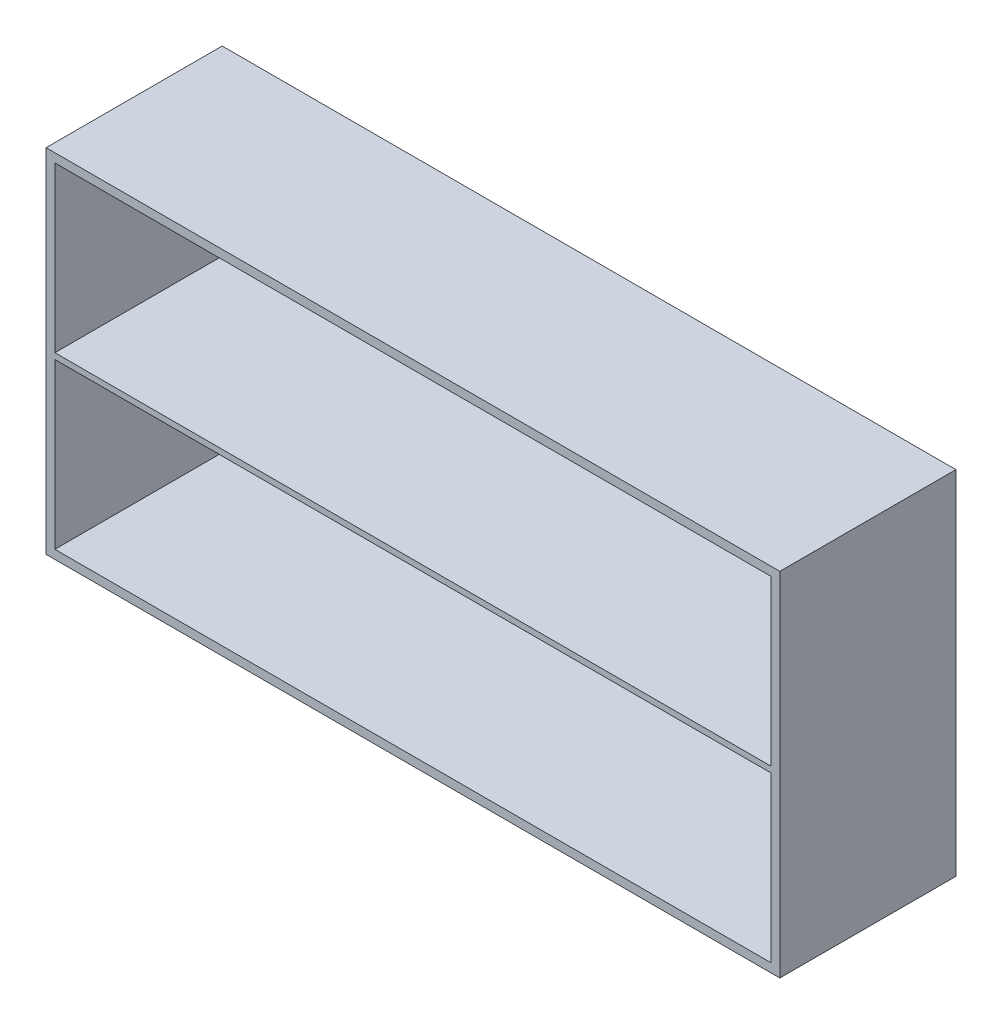
ISO-10303-21;
HEADER;
FILE_DESCRIPTION(('STEP AP214'),'2;1');
FILE_NAME('part.step','',(''),(''),'','','');
FILE_SCHEMA(('AUTOMOTIVE_DESIGN { 1 0 10303 214 1 1 1 1 }'));
ENDSEC;
DATA;
#1=APPLICATION_CONTEXT('core data for automotive mechanical design processes');
#2=APPLICATION_PROTOCOL_DEFINITION('international standard','automotive_design',2000,#1);
#3=PRODUCT_CONTEXT('',#1,'mechanical');
#4=PRODUCT('Part','Part','',(#3));
#5=PRODUCT_RELATED_PRODUCT_CATEGORY('part','',(#4));
#6=PRODUCT_DEFINITION_FORMATION('','',#4);
#7=PRODUCT_DEFINITION_CONTEXT('part definition',#1,'design');
#8=PRODUCT_DEFINITION('design','',#6,#7);
#9=PRODUCT_DEFINITION_SHAPE('','',#8);
#10=(LENGTH_UNIT() NAMED_UNIT(*) SI_UNIT(.MILLI.,.METRE.));
#11=(NAMED_UNIT(*) PLANE_ANGLE_UNIT() SI_UNIT($,.RADIAN.));
#12=(NAMED_UNIT(*) SI_UNIT($,.STERADIAN.) SOLID_ANGLE_UNIT());
#13=UNCERTAINTY_MEASURE_WITH_UNIT(LENGTH_MEASURE(1.E-05),#10,'distance_accuracy_value','');
#14=(GEOMETRIC_REPRESENTATION_CONTEXT(3) GLOBAL_UNCERTAINTY_ASSIGNED_CONTEXT((#13)) GLOBAL_UNIT_ASSIGNED_CONTEXT((#10,
#11,#12)) REPRESENTATION_CONTEXT('',''));
#15=CARTESIAN_POINT('',(0.,0.,0.));
#16=DIRECTION('',(0.,0.,1.));
#17=DIRECTION('',(1.,0.,0.));
#18=AXIS2_PLACEMENT_3D('',#15,#16,#17);
#19=CARTESIAN_POINT('',(0.,-585.,300.));
#20=DIRECTION('',(0.,1.,0.));
#21=DIRECTION('',(0.,0.,1.));
#22=AXIS2_PLACEMENT_3D('',#19,#20,#21);
#23=PLANE('',#22);
#24=DIRECTION('',(1.,0.,0.));
#25=VECTOR('',#24,1.);
#26=CARTESIAN_POINT('',(0.,-585.,5.));
#27=LINE('',#26,#25);
#28=CARTESIAN_POINT('',(-610.,-585.,5.));
#29=VERTEX_POINT('',#28);
#30=CARTESIAN_POINT('',(610.,-585.,5.));
#31=VERTEX_POINT('',#30);
#32=EDGE_CURVE('E50',#29,#31,#27,.T.);
#33=ORIENTED_EDGE('',*,*,#32,.F.);
#34=DIRECTION('',(0.,0.,-1.));
#35=VECTOR('',#34,1.);
#36=CARTESIAN_POINT('',(-610.,-585.,300.));
#37=LINE('',#36,#35);
#38=CARTESIAN_POINT('',(-610.,-585.,300.));
#39=VERTEX_POINT('',#38);
#40=EDGE_CURVE('E43',#39,#29,#37,.T.);
#41=ORIENTED_EDGE('',*,*,#40,.F.);
#42=DIRECTION('',(1.,0.,0.));
#43=VECTOR('',#42,1.);
#44=CARTESIAN_POINT('',(0.,-585.,300.));
#45=LINE('',#44,#43);
#46=CARTESIAN_POINT('',(610.,-585.,300.));
#47=VERTEX_POINT('',#46);
#48=EDGE_CURVE('E179',#39,#47,#45,.T.);
#49=ORIENTED_EDGE('',*,*,#48,.T.);
#50=DIRECTION('',(0.,0.,-1.));
#51=VECTOR('',#50,1.);
#52=CARTESIAN_POINT('',(610.,-585.,300.));
#53=LINE('',#52,#51);
#54=EDGE_CURVE('E133',#47,#31,#53,.T.);
#55=ORIENTED_EDGE('',*,*,#54,.T.);
#56=EDGE_LOOP('',(#33,#41,#49,#55));
#57=FACE_BOUND('',#56,.T.);
#58=ADVANCED_FACE('F35',(#57),#23,.T.);
#59=CARTESIAN_POINT('',(-610.,0.,300.));
#60=DIRECTION('',(-1.,0.,0.));
#61=DIRECTION('',(0.,0.,1.));
#62=AXIS2_PLACEMENT_3D('',#59,#60,#61);
#63=PLANE('',#62);
#64=ORIENTED_EDGE('',*,*,#40,.T.);
#65=DIRECTION('',(0.,1.,0.));
#66=VECTOR('',#65,1.);
#67=CARTESIAN_POINT('',(-610.,0.,5.));
#68=LINE('',#67,#66);
#69=CARTESIAN_POINT('',(-610.,-305.,5.));
#70=VERTEX_POINT('',#69);
#71=EDGE_CURVE('E57',#29,#70,#68,.T.);
#72=ORIENTED_EDGE('',*,*,#71,.T.);
#73=DIRECTION('',(0.,0.,-1.));
#74=VECTOR('',#73,1.);
#75=CARTESIAN_POINT('',(-610.,-305.,300.));
#76=LINE('',#75,#74);
#77=CARTESIAN_POINT('',(-610.,-305.,300.));
#78=VERTEX_POINT('',#77);
#79=EDGE_CURVE('E132',#78,#70,#76,.T.);
#80=ORIENTED_EDGE('',*,*,#79,.F.);
#81=DIRECTION('',(0.,1.,0.));
#82=VECTOR('',#81,1.);
#83=CARTESIAN_POINT('',(-610.,0.,300.));
#84=LINE('',#83,#82);
#85=EDGE_CURVE('E163',#39,#78,#84,.T.);
#86=ORIENTED_EDGE('',*,*,#85,.F.);
#87=EDGE_LOOP('',(#64,#72,#80,#86));
#88=FACE_BOUND('',#87,.T.);
#89=ADVANCED_FACE('F246',(#88),#63,.F.);
#90=CARTESIAN_POINT('',(0.,-305.,300.));
#91=DIRECTION('',(0.,1.,0.));
#92=DIRECTION('',(0.,0.,1.));
#93=AXIS2_PLACEMENT_3D('',#90,#91,#92);
#94=PLANE('',#93);
#95=ORIENTED_EDGE('',*,*,#79,.T.);
#96=DIRECTION('',(1.,0.,0.));
#97=VECTOR('',#96,1.);
#98=CARTESIAN_POINT('',(0.,-305.,5.));
#99=LINE('',#98,#97);
#100=CARTESIAN_POINT('',(610.,-305.,5.));
#101=VERTEX_POINT('',#100);
#102=EDGE_CURVE('E136',#70,#101,#99,.T.);
#103=ORIENTED_EDGE('',*,*,#102,.T.);
#104=DIRECTION('',(0.,0.,-1.));
#105=VECTOR('',#104,1.);
#106=CARTESIAN_POINT('',(610.,-305.,300.));
#107=LINE('',#106,#105);
#108=CARTESIAN_POINT('',(610.,-305.,300.));
#109=VERTEX_POINT('',#108);
#110=EDGE_CURVE('E126',#109,#101,#107,.T.);
#111=ORIENTED_EDGE('',*,*,#110,.F.);
#112=DIRECTION('',(1.,0.,0.));
#113=VECTOR('',#112,1.);
#114=CARTESIAN_POINT('',(0.,-305.,300.));
#115=LINE('',#114,#113);
#116=EDGE_CURVE('E182',#78,#109,#115,.T.);
#117=ORIENTED_EDGE('',*,*,#116,.F.);
#118=EDGE_LOOP('',(#95,#103,#111,#117));
#119=FACE_BOUND('',#118,.T.);
#120=ADVANCED_FACE('F137',(#119),#94,.F.);
#121=CARTESIAN_POINT('',(0.,-600.,300.));
#122=DIRECTION('',(0.,1.,0.));
#123=DIRECTION('',(0.,0.,1.));
#124=AXIS2_PLACEMENT_3D('',#121,#122,#123);
#125=PLANE('',#124);
#126=DIRECTION('',(0.,0.,-1.));
#127=VECTOR('',#126,1.);
#128=CARTESIAN_POINT('',(-625.,-600.,300.));
#129=LINE('',#128,#127);
#130=CARTESIAN_POINT('',(-625.,-600.,300.));
#131=VERTEX_POINT('',#130);
#132=CARTESIAN_POINT('',(-625.,-600.,0.));
#133=VERTEX_POINT('',#132);
#134=EDGE_CURVE('E198',#131,#133,#129,.T.);
#135=ORIENTED_EDGE('',*,*,#134,.T.);
#136=DIRECTION('',(1.,0.,0.));
#137=VECTOR('',#136,1.);
#138=CARTESIAN_POINT('',(0.,-600.,0.));
#139=LINE('',#138,#137);
#140=CARTESIAN_POINT('',(625.,-600.,0.));
#141=VERTEX_POINT('',#140);
#142=EDGE_CURVE('E155',#133,#141,#139,.T.);
#143=ORIENTED_EDGE('',*,*,#142,.T.);
#144=DIRECTION('',(0.,0.,-1.));
#145=VECTOR('',#144,1.);
#146=CARTESIAN_POINT('',(625.,-600.,300.));
#147=LINE('',#146,#145);
#148=CARTESIAN_POINT('',(625.,-600.,300.));
#149=VERTEX_POINT('',#148);
#150=EDGE_CURVE('E194',#149,#141,#147,.T.);
#151=ORIENTED_EDGE('',*,*,#150,.F.);
#152=DIRECTION('',(1.,0.,0.));
#153=VECTOR('',#152,1.);
#154=CARTESIAN_POINT('',(0.,-600.,300.));
#155=LINE('',#154,#153);
#156=EDGE_CURVE('E168',#131,#149,#155,.T.);
#157=ORIENTED_EDGE('',*,*,#156,.F.);
#158=EDGE_LOOP('',(#135,#143,#151,#157));
#159=FACE_BOUND('',#158,.T.);
#160=ADVANCED_FACE('F260',(#159),#125,.F.);
#161=CARTESIAN_POINT('',(625.,0.,300.));
#162=DIRECTION('',(-1.,0.,0.));
#163=DIRECTION('',(0.,0.,1.));
#164=AXIS2_PLACEMENT_3D('',#161,#162,#163);
#165=PLANE('',#164);
#166=ORIENTED_EDGE('',*,*,#150,.T.);
#167=DIRECTION('',(0.,1.,0.));
#168=VECTOR('',#167,1.);
#169=CARTESIAN_POINT('',(625.,0.,0.));
#170=LINE('',#169,#168);
#171=CARTESIAN_POINT('',(625.,0.,0.));
#172=VERTEX_POINT('',#171);
#173=EDGE_CURVE('E186',#141,#172,#170,.T.);
#174=ORIENTED_EDGE('',*,*,#173,.T.);
#175=DIRECTION('',(0.,0.,-1.));
#176=VECTOR('',#175,1.);
#177=CARTESIAN_POINT('',(625.,0.,300.));
#178=LINE('',#177,#176);
#179=CARTESIAN_POINT('',(625.,0.,300.));
#180=VERTEX_POINT('',#179);
#181=EDGE_CURVE('E203',#180,#172,#178,.T.);
#182=ORIENTED_EDGE('',*,*,#181,.F.);
#183=DIRECTION('',(0.,1.,0.));
#184=VECTOR('',#183,1.);
#185=CARTESIAN_POINT('',(625.,0.,300.));
#186=LINE('',#185,#184);
#187=EDGE_CURVE('E171',#149,#180,#186,.T.);
#188=ORIENTED_EDGE('',*,*,#187,.F.);
#189=EDGE_LOOP('',(#166,#174,#182,#188));
#190=FACE_BOUND('',#189,.T.);
#191=ADVANCED_FACE('F256',(#190),#165,.F.);
#192=CARTESIAN_POINT('',(0.,0.,300.));
#193=DIRECTION('',(0.,1.,0.));
#194=DIRECTION('',(0.,0.,1.));
#195=AXIS2_PLACEMENT_3D('',#192,#193,#194);
#196=PLANE('',#195);
#197=ORIENTED_EDGE('',*,*,#181,.T.);
#198=DIRECTION('',(1.,0.,0.));
#199=VECTOR('',#198,1.);
#200=CARTESIAN_POINT('',(0.,0.,0.));
#201=LINE('',#200,#199);
#202=CARTESIAN_POINT('',(-625.,0.,0.));
#203=VERTEX_POINT('',#202);
#204=EDGE_CURVE('E189',#203,#172,#201,.T.);
#205=ORIENTED_EDGE('',*,*,#204,.F.);
#206=DIRECTION('',(0.,0.,-1.));
#207=VECTOR('',#206,1.);
#208=CARTESIAN_POINT('',(-625.,0.,300.));
#209=LINE('',#208,#207);
#210=CARTESIAN_POINT('',(-625.,0.,300.));
#211=VERTEX_POINT('',#210);
#212=EDGE_CURVE('E200',#211,#203,#209,.T.);
#213=ORIENTED_EDGE('',*,*,#212,.F.);
#214=DIRECTION('',(1.,0.,0.));
#215=VECTOR('',#214,1.);
#216=CARTESIAN_POINT('',(0.,0.,300.));
#217=LINE('',#216,#215);
#218=EDGE_CURVE('E173',#211,#180,#217,.T.);
#219=ORIENTED_EDGE('',*,*,#218,.T.);
#220=EDGE_LOOP('',(#197,#205,#213,#219));
#221=FACE_BOUND('',#220,.T.);
#222=ADVANCED_FACE('F253',(#221),#196,.T.);
#223=CARTESIAN_POINT('',(0.,-295.,300.));
#224=DIRECTION('',(0.,1.,0.));
#225=DIRECTION('',(0.,0.,1.));
#226=AXIS2_PLACEMENT_3D('',#223,#224,#225);
#227=PLANE('',#226);
#228=DIRECTION('',(1.,0.,0.));
#229=VECTOR('',#228,1.);
#230=CARTESIAN_POINT('',(0.,-295.,5.));
#231=LINE('',#230,#229);
#232=CARTESIAN_POINT('',(-610.,-295.,5.));
#233=VERTEX_POINT('',#232);
#234=CARTESIAN_POINT('',(610.,-295.,5.));
#235=VERTEX_POINT('',#234);
#236=EDGE_CURVE('E152',#233,#235,#231,.T.);
#237=ORIENTED_EDGE('',*,*,#236,.F.);
#238=DIRECTION('',(0.,0.,-1.));
#239=VECTOR('',#238,1.);
#240=CARTESIAN_POINT('',(-610.,-295.,300.));
#241=LINE('',#240,#239);
#242=CARTESIAN_POINT('',(-610.,-295.,300.));
#243=VERTEX_POINT('',#242);
#244=EDGE_CURVE('E201',#243,#233,#241,.T.);
#245=ORIENTED_EDGE('',*,*,#244,.F.);
#246=DIRECTION('',(1.,0.,0.));
#247=VECTOR('',#246,1.);
#248=CARTESIAN_POINT('',(0.,-295.,300.));
#249=LINE('',#248,#247);
#250=CARTESIAN_POINT('',(610.,-295.,300.));
#251=VERTEX_POINT('',#250);
#252=EDGE_CURVE('E156',#243,#251,#249,.T.);
#253=ORIENTED_EDGE('',*,*,#252,.T.);
#254=DIRECTION('',(0.,0.,-1.));
#255=VECTOR('',#254,1.);
#256=CARTESIAN_POINT('',(610.,-295.,300.));
#257=LINE('',#256,#255);
#258=EDGE_CURVE('E206',#251,#235,#257,.T.);
#259=ORIENTED_EDGE('',*,*,#258,.T.);
#260=EDGE_LOOP('',(#237,#245,#253,#259));
#261=FACE_BOUND('',#260,.T.);
#262=ADVANCED_FACE('F37',(#261),#227,.T.);
#263=ORIENTED_EDGE('',*,*,#244,.T.);
#264=DIRECTION('',(0.,1.,0.));
#265=VECTOR('',#264,1.);
#266=CARTESIAN_POINT('',(-610.,0.,5.));
#267=LINE('',#266,#265);
#268=CARTESIAN_POINT('',(-610.,-15.,5.));
#269=VERTEX_POINT('',#268);
#270=EDGE_CURVE('E150',#233,#269,#267,.T.);
#271=ORIENTED_EDGE('',*,*,#270,.T.);
#272=DIRECTION('',(0.,0.,-1.));
#273=VECTOR('',#272,1.);
#274=CARTESIAN_POINT('',(-610.,-15.,300.));
#275=LINE('',#274,#273);
#276=CARTESIAN_POINT('',(-610.,-15.,300.));
#277=VERTEX_POINT('',#276);
#278=EDGE_CURVE('E211',#277,#269,#275,.T.);
#279=ORIENTED_EDGE('',*,*,#278,.F.);
#280=EDGE_CURVE('E159',#243,#277,#84,.T.);
#281=ORIENTED_EDGE('',*,*,#280,.F.);
#282=EDGE_LOOP('',(#263,#271,#279,#281));
#283=FACE_BOUND('',#282,.T.);
#284=ADVANCED_FACE('F217',(#283),#63,.F.);
#285=CARTESIAN_POINT('',(0.,-15.,300.));
#286=DIRECTION('',(0.,1.,0.));
#287=DIRECTION('',(-1.,0.,0.));
#288=AXIS2_PLACEMENT_3D('',#285,#286,#287);
#289=PLANE('',#288);
#290=ORIENTED_EDGE('',*,*,#278,.T.);
#291=DIRECTION('',(1.,0.,0.));
#292=VECTOR('',#291,1.);
#293=CARTESIAN_POINT('',(0.,-15.,5.));
#294=LINE('',#293,#292);
#295=CARTESIAN_POINT('',(610.,-15.,5.));
#296=VERTEX_POINT('',#295);
#297=EDGE_CURVE('E144',#269,#296,#294,.T.);
#298=ORIENTED_EDGE('',*,*,#297,.T.);
#299=DIRECTION('',(0.,0.,-1.));
#300=VECTOR('',#299,1.);
#301=CARTESIAN_POINT('',(610.,-15.,300.));
#302=LINE('',#301,#300);
#303=CARTESIAN_POINT('',(610.,-15.,300.));
#304=VERTEX_POINT('',#303);
#305=EDGE_CURVE('E209',#304,#296,#302,.T.);
#306=ORIENTED_EDGE('',*,*,#305,.F.);
#307=DIRECTION('',(1.,0.,0.));
#308=VECTOR('',#307,1.);
#309=CARTESIAN_POINT('',(0.,-15.,300.));
#310=LINE('',#309,#308);
#311=EDGE_CURVE('E162',#277,#304,#310,.T.);
#312=ORIENTED_EDGE('',*,*,#311,.F.);
#313=EDGE_LOOP('',(#290,#298,#306,#312));
#314=FACE_BOUND('',#313,.T.);
#315=ADVANCED_FACE('F226',(#314),#289,.F.);
#316=CARTESIAN_POINT('',(-625.,0.,300.));
#317=DIRECTION('',(-1.,0.,0.));
#318=DIRECTION('',(0.,0.,1.));
#319=AXIS2_PLACEMENT_3D('',#316,#317,#318);
#320=PLANE('',#319);
#321=ORIENTED_EDGE('',*,*,#212,.T.);
#322=DIRECTION('',(0.,1.,0.));
#323=VECTOR('',#322,1.);
#324=CARTESIAN_POINT('',(-625.,0.,0.));
#325=LINE('',#324,#323);
#326=EDGE_CURVE('E160',#133,#203,#325,.T.);
#327=ORIENTED_EDGE('',*,*,#326,.F.);
#328=ORIENTED_EDGE('',*,*,#134,.F.);
#329=DIRECTION('',(0.,1.,0.));
#330=VECTOR('',#329,1.);
#331=CARTESIAN_POINT('',(-625.,0.,300.));
#332=LINE('',#331,#330);
#333=EDGE_CURVE('E176',#131,#211,#332,.T.);
#334=ORIENTED_EDGE('',*,*,#333,.T.);
#335=EDGE_LOOP('',(#321,#327,#328,#334));
#336=FACE_BOUND('',#335,.T.);
#337=ADVANCED_FACE('F235',(#336),#320,.T.);
#338=CARTESIAN_POINT('',(610.,-1.18813341231815E-13,300.));
#339=DIRECTION('',(-1.,0.,0.));
#340=DIRECTION('',(0.,-1.,0.));
#341=AXIS2_PLACEMENT_3D('',#338,#339,#340);
#342=PLANE('',#341);
#343=DIRECTION('',(0.,1.,0.));
#344=VECTOR('',#343,1.);
#345=CARTESIAN_POINT('',(610.,-1.18813341231815E-13,5.));
#346=LINE('',#345,#344);
#347=EDGE_CURVE('E141',#235,#296,#346,.T.);
#348=ORIENTED_EDGE('',*,*,#347,.F.);
#349=ORIENTED_EDGE('',*,*,#258,.F.);
#350=DIRECTION('',(0.,1.,0.));
#351=VECTOR('',#350,1.);
#352=CARTESIAN_POINT('',(610.,-1.18813341231815E-13,300.));
#353=LINE('',#352,#351);
#354=EDGE_CURVE('E165',#251,#304,#353,.T.);
#355=ORIENTED_EDGE('',*,*,#354,.T.);
#356=ORIENTED_EDGE('',*,*,#305,.T.);
#357=EDGE_LOOP('',(#348,#349,#355,#356));
#358=FACE_BOUND('',#357,.T.);
#359=ADVANCED_FACE('F233',(#358),#342,.T.);
#360=DIRECTION('',(0.,1.,0.));
#361=VECTOR('',#360,1.);
#362=CARTESIAN_POINT('',(610.,-1.18813341231815E-13,5.));
#363=LINE('',#362,#361);
#364=EDGE_CURVE('E11',#31,#101,#363,.T.);
#365=ORIENTED_EDGE('',*,*,#364,.F.);
#366=ORIENTED_EDGE('',*,*,#54,.F.);
#367=EDGE_CURVE('E130',#47,#109,#353,.T.);
#368=ORIENTED_EDGE('',*,*,#367,.T.);
#369=ORIENTED_EDGE('',*,*,#110,.T.);
#370=EDGE_LOOP('',(#365,#366,#368,#369));
#371=FACE_BOUND('',#370,.T.);
#372=ADVANCED_FACE('F128',(#371),#342,.T.);
#373=CARTESIAN_POINT('',(0.,0.,300.));
#374=DIRECTION('',(0.,0.,1.));
#375=DIRECTION('',(1.,0.,0.));
#376=AXIS2_PLACEMENT_3D('',#373,#374,#375);
#377=PLANE('',#376);
#378=ORIENTED_EDGE('',*,*,#252,.F.);
#379=ORIENTED_EDGE('',*,*,#280,.T.);
#380=ORIENTED_EDGE('',*,*,#311,.T.);
#381=ORIENTED_EDGE('',*,*,#354,.F.);
#382=EDGE_LOOP('',(#378,#379,#380,#381));
#383=FACE_BOUND('',#382,.T.);
#384=ORIENTED_EDGE('',*,*,#156,.T.);
#385=ORIENTED_EDGE('',*,*,#187,.T.);
#386=ORIENTED_EDGE('',*,*,#218,.F.);
#387=ORIENTED_EDGE('',*,*,#333,.F.);
#388=EDGE_LOOP('',(#384,#385,#386,#387));
#389=FACE_BOUND('',#388,.T.);
#390=ORIENTED_EDGE('',*,*,#48,.F.);
#391=ORIENTED_EDGE('',*,*,#85,.T.);
#392=ORIENTED_EDGE('',*,*,#116,.T.);
#393=ORIENTED_EDGE('',*,*,#367,.F.);
#394=EDGE_LOOP('',(#390,#391,#392,#393));
#395=FACE_BOUND('',#394,.T.);
#396=ADVANCED_FACE('F230',(#383,#389,#395),#377,.T.);
#397=CARTESIAN_POINT('',(0.,0.,0.));
#398=DIRECTION('',(0.,0.,1.));
#399=DIRECTION('',(1.,0.,0.));
#400=AXIS2_PLACEMENT_3D('',#397,#398,#399);
#401=PLANE('',#400);
#402=ORIENTED_EDGE('',*,*,#142,.F.);
#403=ORIENTED_EDGE('',*,*,#326,.T.);
#404=ORIENTED_EDGE('',*,*,#204,.T.);
#405=ORIENTED_EDGE('',*,*,#173,.F.);
#406=EDGE_LOOP('',(#402,#403,#404,#405));
#407=FACE_BOUND('',#406,.T.);
#408=ADVANCED_FACE('F306',(#407),#401,.F.);
#409=CARTESIAN_POINT('',(0.,0.,5.));
#410=DIRECTION('',(0.,0.,1.));
#411=DIRECTION('',(1.,0.,0.));
#412=AXIS2_PLACEMENT_3D('',#409,#410,#411);
#413=PLANE('',#412);
#414=ORIENTED_EDGE('',*,*,#71,.F.);
#415=ORIENTED_EDGE('',*,*,#32,.T.);
#416=ORIENTED_EDGE('',*,*,#364,.T.);
#417=ORIENTED_EDGE('',*,*,#102,.F.);
#418=EDGE_LOOP('',(#414,#415,#416,#417));
#419=FACE_BOUND('',#418,.T.);
#420=ADVANCED_FACE('F140',(#419),#413,.T.);
#421=ORIENTED_EDGE('',*,*,#270,.F.);
#422=ORIENTED_EDGE('',*,*,#236,.T.);
#423=ORIENTED_EDGE('',*,*,#347,.T.);
#424=ORIENTED_EDGE('',*,*,#297,.F.);
#425=EDGE_LOOP('',(#421,#422,#423,#424));
#426=FACE_BOUND('',#425,.T.);
#427=ADVANCED_FACE('F223',(#426),#413,.T.);
#428=CLOSED_SHELL('',(#58,#89,#120,#160,#191,#222,#262,#284,#315,#337,#359,#372,#396,#408,#420,#427));
#429=MANIFOLD_SOLID_BREP('B2',#428);
#430=ADVANCED_BREP_SHAPE_REPRESENTATION('',(#18,#429),#14);
#431=SHAPE_DEFINITION_REPRESENTATION(#9,#430);
ENDSEC;
END-ISO-10303-21;
